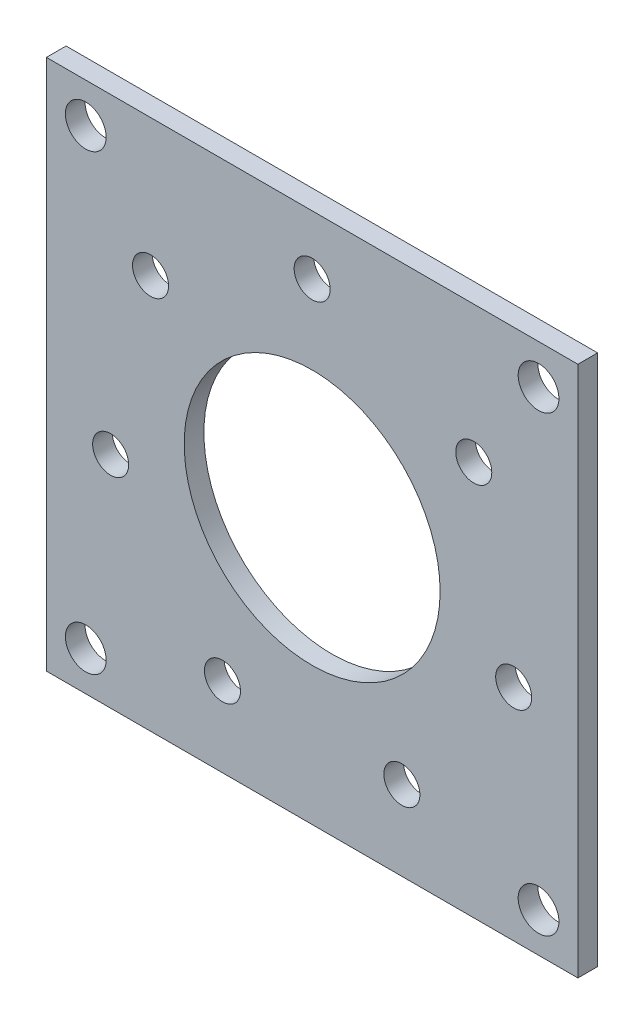
ISO-10303-21;
HEADER;
FILE_DESCRIPTION(('STEP AP214'),'2;1');
FILE_NAME('part.step','',(''),(''),'','','');
FILE_SCHEMA(('AUTOMOTIVE_DESIGN { 1 0 10303 214 1 1 1 1 }'));
ENDSEC;
DATA;
#1=APPLICATION_CONTEXT('core data for automotive mechanical design processes');
#2=APPLICATION_PROTOCOL_DEFINITION('international standard','automotive_design',2000,#1);
#3=PRODUCT_CONTEXT('',#1,'mechanical');
#4=PRODUCT('Part','Part','',(#3));
#5=PRODUCT_RELATED_PRODUCT_CATEGORY('part','',(#4));
#6=PRODUCT_DEFINITION_FORMATION('','',#4);
#7=PRODUCT_DEFINITION_CONTEXT('part definition',#1,'design');
#8=PRODUCT_DEFINITION('design','',#6,#7);
#9=PRODUCT_DEFINITION_SHAPE('','',#8);
#10=(LENGTH_UNIT() NAMED_UNIT(*) SI_UNIT(.MILLI.,.METRE.));
#11=(NAMED_UNIT(*) PLANE_ANGLE_UNIT() SI_UNIT($,.RADIAN.));
#12=(NAMED_UNIT(*) SI_UNIT($,.STERADIAN.) SOLID_ANGLE_UNIT());
#13=UNCERTAINTY_MEASURE_WITH_UNIT(LENGTH_MEASURE(1.E-05),#10,'distance_accuracy_value','');
#14=(GEOMETRIC_REPRESENTATION_CONTEXT(3) GLOBAL_UNCERTAINTY_ASSIGNED_CONTEXT((#13)) GLOBAL_UNIT_ASSIGNED_CONTEXT((#10,
#11,#12)) REPRESENTATION_CONTEXT('',''));
#15=CARTESIAN_POINT('',(0.,0.,0.));
#16=DIRECTION('',(0.,0.,1.));
#17=DIRECTION('',(1.,0.,0.));
#18=AXIS2_PLACEMENT_3D('',#15,#16,#17);
#19=CARTESIAN_POINT('',(0.,0.,5.));
#20=DIRECTION('',(0.,0.,-1.));
#21=DIRECTION('',(-1.,0.,0.));
#22=AXIS2_PLACEMENT_3D('',#19,#20,#21);
#23=PLANE('',#22);
#24=CARTESIAN_POINT('',(-51.183715389543,-11.6823490327087,5.));
#25=DIRECTION('',(0.,0.,1.));
#26=DIRECTION('',(1.,0.,0.));
#27=AXIS2_PLACEMENT_3D('',#24,#25,#26);
#28=CIRCLE('',#27,4.57699286697518);
#29=CARTESIAN_POINT('',(-46.6067225225678,-11.6823490327087,5.));
#30=VERTEX_POINT('',#29);
#31=EDGE_CURVE('E169',#30,#30,#28,.T.);
#32=ORIENTED_EDGE('',*,*,#31,.F.);
#33=EDGE_LOOP('',(#32));
#34=FACE_BOUND('',#33,.T.);
#35=CARTESIAN_POINT('',(22.7788963036761,-47.300865564876,5.));
#36=DIRECTION('',(0.,0.,1.));
#37=DIRECTION('',(1.,0.,0.));
#38=AXIS2_PLACEMENT_3D('',#35,#36,#37);
#39=CIRCLE('',#38,4.57699286697552);
#40=CARTESIAN_POINT('',(27.3558891706516,-47.300865564876,5.));
#41=VERTEX_POINT('',#40);
#42=EDGE_CURVE('E157',#41,#41,#39,.T.);
#43=ORIENTED_EDGE('',*,*,#42,.F.);
#44=EDGE_LOOP('',(#43));
#45=FACE_BOUND('',#44,.T.);
#46=CARTESIAN_POINT('',(41.0461528295716,32.7332145975834,5.));
#47=DIRECTION('',(0.,0.,1.));
#48=DIRECTION('',(1.,0.,0.));
#49=AXIS2_PLACEMENT_3D('',#46,#47,#48);
#50=CIRCLE('',#49,4.57699286697144);
#51=CARTESIAN_POINT('',(45.6231456965431,32.7332145975834,5.));
#52=VERTEX_POINT('',#51);
#53=EDGE_CURVE('E145',#52,#52,#50,.T.);
#54=ORIENTED_EDGE('',*,*,#53,.F.);
#55=EDGE_LOOP('',(#54));
#56=FACE_BOUND('',#55,.T.);
#57=CARTESIAN_POINT('',(0.,0.,5.));
#58=DIRECTION('',(0.,0.,1.));
#59=DIRECTION('',(1.,0.,0.));
#60=AXIS2_PLACEMENT_3D('',#57,#58,#59);
#61=CIRCLE('',#60,32.5);
#62=CARTESIAN_POINT('',(32.5,0.,5.));
#63=VERTEX_POINT('',#62);
#64=EDGE_CURVE('E133',#63,#63,#61,.T.);
#65=ORIENTED_EDGE('',*,*,#64,.F.);
#66=EDGE_LOOP('',(#65));
#67=FACE_BOUND('',#66,.T.);
#68=CARTESIAN_POINT('',(57.5,-57.5,5.));
#69=DIRECTION('',(0.,0.,1.));
#70=DIRECTION('',(1.,0.,0.));
#71=AXIS2_PLACEMENT_3D('',#68,#69,#70);
#72=CIRCLE('',#71,5.17833459756658);
#73=CARTESIAN_POINT('',(62.6783345975666,-57.5,5.));
#74=VERTEX_POINT('',#73);
#75=EDGE_CURVE('E121',#74,#74,#72,.T.);
#76=ORIENTED_EDGE('',*,*,#75,.F.);
#77=EDGE_LOOP('',(#76));
#78=FACE_BOUND('',#77,.T.);
#79=CARTESIAN_POINT('',(-57.5,57.5,5.));
#80=DIRECTION('',(0.,0.,1.));
#81=DIRECTION('',(1.,0.,0.));
#82=AXIS2_PLACEMENT_3D('',#79,#80,#81);
#83=CIRCLE('',#82,5.17833459756658);
#84=CARTESIAN_POINT('',(-52.3216654024334,57.5,5.));
#85=VERTEX_POINT('',#84);
#86=EDGE_CURVE('E100',#85,#85,#83,.T.);
#87=ORIENTED_EDGE('',*,*,#86,.F.);
#88=EDGE_LOOP('',(#87));
#89=FACE_BOUND('',#88,.T.);
#90=DIRECTION('',(0.,1.,0.));
#91=VECTOR('',#90,1.);
#92=CARTESIAN_POINT('',(67.5,-67.5,5.));
#93=LINE('',#92,#91);
#94=CARTESIAN_POINT('',(67.5,-67.5,5.));
#95=VERTEX_POINT('',#94);
#96=CARTESIAN_POINT('',(67.5,67.5,5.));
#97=VERTEX_POINT('',#96);
#98=EDGE_CURVE('E85',#95,#97,#93,.T.);
#99=ORIENTED_EDGE('',*,*,#98,.T.);
#100=DIRECTION('',(-1.,0.,0.));
#101=VECTOR('',#100,1.);
#102=CARTESIAN_POINT('',(-67.5,67.5,5.));
#103=LINE('',#102,#101);
#104=CARTESIAN_POINT('',(-67.5,67.5,5.));
#105=VERTEX_POINT('',#104);
#106=EDGE_CURVE('E80',#97,#105,#103,.T.);
#107=ORIENTED_EDGE('',*,*,#106,.T.);
#108=DIRECTION('',(0.,-1.,0.));
#109=VECTOR('',#108,1.);
#110=CARTESIAN_POINT('',(-67.5,-67.5,5.));
#111=LINE('',#110,#109);
#112=CARTESIAN_POINT('',(-67.5,-67.5,5.));
#113=VERTEX_POINT('',#112);
#114=EDGE_CURVE('E83',#105,#113,#111,.T.);
#115=ORIENTED_EDGE('',*,*,#114,.T.);
#116=DIRECTION('',(1.,0.,0.));
#117=VECTOR('',#116,1.);
#118=CARTESIAN_POINT('',(-67.5,-67.5,5.));
#119=LINE('',#118,#117);
#120=EDGE_CURVE('E50',#113,#95,#119,.T.);
#121=ORIENTED_EDGE('',*,*,#120,.T.);
#122=EDGE_LOOP('',(#99,#107,#115,#121));
#123=FACE_BOUND('',#122,.T.);
#124=CARTESIAN_POINT('',(-57.5,-57.5,5.));
#125=DIRECTION('',(0.,0.,1.));
#126=DIRECTION('',(-1.,0.,0.));
#127=AXIS2_PLACEMENT_3D('',#124,#125,#126);
#128=CIRCLE('',#127,5.17833459756658);
#129=CARTESIAN_POINT('',(-62.6783345975666,-57.5,5.));
#130=VERTEX_POINT('',#129);
#131=EDGE_CURVE('E115',#130,#130,#128,.T.);
#132=ORIENTED_EDGE('',*,*,#131,.F.);
#133=EDGE_LOOP('',(#132));
#134=FACE_BOUND('',#133,.T.);
#135=CARTESIAN_POINT('',(57.5,57.5,5.));
#136=DIRECTION('',(0.,0.,1.));
#137=DIRECTION('',(-1.,0.,0.));
#138=AXIS2_PLACEMENT_3D('',#135,#136,#137);
#139=CIRCLE('',#138,5.17833459756658);
#140=CARTESIAN_POINT('',(52.3216654024334,57.5,5.));
#141=VERTEX_POINT('',#140);
#142=EDGE_CURVE('E127',#141,#141,#139,.T.);
#143=ORIENTED_EDGE('',*,*,#142,.F.);
#144=EDGE_LOOP('',(#143));
#145=FACE_BOUND('',#144,.T.);
#146=CARTESIAN_POINT('',(0.,52.5,5.));
#147=DIRECTION('',(0.,0.,1.));
#148=DIRECTION('',(1.,0.,0.));
#149=AXIS2_PLACEMENT_3D('',#146,#147,#148);
#150=CIRCLE('',#149,4.57699286697144);
#151=CARTESIAN_POINT('',(4.57699286697144,52.5,5.));
#152=VERTEX_POINT('',#151);
#153=EDGE_CURVE('E139',#152,#152,#150,.T.);
#154=ORIENTED_EDGE('',*,*,#153,.F.);
#155=EDGE_LOOP('',(#154));
#156=FACE_BOUND('',#155,.T.);
#157=CARTESIAN_POINT('',(51.1837153895485,-11.6823490327043,5.));
#158=DIRECTION('',(0.,0.,1.));
#159=DIRECTION('',(1.,0.,0.));
#160=AXIS2_PLACEMENT_3D('',#157,#158,#159);
#161=CIRCLE('',#160,4.57699286697361);
#162=CARTESIAN_POINT('',(55.7607082565221,-11.6823490327043,5.));
#163=VERTEX_POINT('',#162);
#164=EDGE_CURVE('E151',#163,#163,#161,.T.);
#165=ORIENTED_EDGE('',*,*,#164,.F.);
#166=EDGE_LOOP('',(#165));
#167=FACE_BOUND('',#166,.T.);
#168=CARTESIAN_POINT('',(-22.7788963036676,-47.300865564878,5.));
#169=DIRECTION('',(0.,0.,1.));
#170=DIRECTION('',(1.,0.,0.));
#171=AXIS2_PLACEMENT_3D('',#168,#169,#170);
#172=CIRCLE('',#171,4.57699286697618);
#173=CARTESIAN_POINT('',(-18.2019034366914,-47.300865564878,5.));
#174=VERTEX_POINT('',#173);
#175=EDGE_CURVE('E163',#174,#174,#172,.T.);
#176=ORIENTED_EDGE('',*,*,#175,.F.);
#177=EDGE_LOOP('',(#176));
#178=FACE_BOUND('',#177,.T.);
#179=CARTESIAN_POINT('',(-41.0461528295707,32.7332145975818,5.));
#180=DIRECTION('',(0.,0.,1.));
#181=DIRECTION('',(1.,0.,0.));
#182=AXIS2_PLACEMENT_3D('',#179,#180,#181);
#183=CIRCLE('',#182,4.57699286697339);
#184=CARTESIAN_POINT('',(-36.4691599625974,32.7332145975818,5.));
#185=VERTEX_POINT('',#184);
#186=EDGE_CURVE('E175',#185,#185,#183,.T.);
#187=ORIENTED_EDGE('',*,*,#186,.F.);
#188=EDGE_LOOP('',(#187));
#189=FACE_BOUND('',#188,.T.);
#190=ADVANCED_FACE('F33',(#34,#45,#56,#67,#78,#89,#123,#134,#145,#156,#167,#178,#189),#23,.F.);
#191=CARTESIAN_POINT('',(0.,0.,0.));
#192=DIRECTION('',(0.,0.,-1.));
#193=DIRECTION('',(-1.,0.,0.));
#194=AXIS2_PLACEMENT_3D('',#191,#192,#193);
#195=PLANE('',#194);
#196=CARTESIAN_POINT('',(-51.183715389543,-11.6823490327087,0.));
#197=DIRECTION('',(0.,0.,1.));
#198=DIRECTION('',(1.,0.,0.));
#199=AXIS2_PLACEMENT_3D('',#196,#197,#198);
#200=CIRCLE('',#199,4.57699286697518);
#201=CARTESIAN_POINT('',(-46.6067225225678,-11.6823490327087,0.));
#202=VERTEX_POINT('',#201);
#203=EDGE_CURVE('E172',#202,#202,#200,.T.);
#204=ORIENTED_EDGE('',*,*,#203,.T.);
#205=EDGE_LOOP('',(#204));
#206=FACE_BOUND('',#205,.T.);
#207=CARTESIAN_POINT('',(22.7788963036761,-47.300865564876,0.));
#208=DIRECTION('',(0.,0.,1.));
#209=DIRECTION('',(1.,0.,0.));
#210=AXIS2_PLACEMENT_3D('',#207,#208,#209);
#211=CIRCLE('',#210,4.57699286697552);
#212=CARTESIAN_POINT('',(27.3558891706516,-47.300865564876,0.));
#213=VERTEX_POINT('',#212);
#214=EDGE_CURVE('E160',#213,#213,#211,.T.);
#215=ORIENTED_EDGE('',*,*,#214,.T.);
#216=EDGE_LOOP('',(#215));
#217=FACE_BOUND('',#216,.T.);
#218=CARTESIAN_POINT('',(41.0461528295716,32.7332145975834,0.));
#219=DIRECTION('',(0.,0.,1.));
#220=DIRECTION('',(1.,0.,0.));
#221=AXIS2_PLACEMENT_3D('',#218,#219,#220);
#222=CIRCLE('',#221,4.57699286697144);
#223=CARTESIAN_POINT('',(45.6231456965431,32.7332145975834,0.));
#224=VERTEX_POINT('',#223);
#225=EDGE_CURVE('E148',#224,#224,#222,.T.);
#226=ORIENTED_EDGE('',*,*,#225,.T.);
#227=EDGE_LOOP('',(#226));
#228=FACE_BOUND('',#227,.T.);
#229=CARTESIAN_POINT('',(0.,0.,0.));
#230=DIRECTION('',(0.,0.,1.));
#231=DIRECTION('',(1.,0.,0.));
#232=AXIS2_PLACEMENT_3D('',#229,#230,#231);
#233=CIRCLE('',#232,32.5);
#234=CARTESIAN_POINT('',(32.5,0.,0.));
#235=VERTEX_POINT('',#234);
#236=EDGE_CURVE('E136',#235,#235,#233,.T.);
#237=ORIENTED_EDGE('',*,*,#236,.T.);
#238=EDGE_LOOP('',(#237));
#239=FACE_BOUND('',#238,.T.);
#240=CARTESIAN_POINT('',(57.5,-57.5,0.));
#241=DIRECTION('',(0.,0.,1.));
#242=DIRECTION('',(1.,0.,0.));
#243=AXIS2_PLACEMENT_3D('',#240,#241,#242);
#244=CIRCLE('',#243,5.17833459756658);
#245=CARTESIAN_POINT('',(62.6783345975666,-57.5,0.));
#246=VERTEX_POINT('',#245);
#247=EDGE_CURVE('E124',#246,#246,#244,.T.);
#248=ORIENTED_EDGE('',*,*,#247,.T.);
#249=EDGE_LOOP('',(#248));
#250=FACE_BOUND('',#249,.T.);
#251=CARTESIAN_POINT('',(-57.5,57.5,0.));
#252=DIRECTION('',(0.,0.,1.));
#253=DIRECTION('',(1.,0.,0.));
#254=AXIS2_PLACEMENT_3D('',#251,#252,#253);
#255=CIRCLE('',#254,5.17833459756658);
#256=CARTESIAN_POINT('',(-52.3216654024334,57.5,0.));
#257=VERTEX_POINT('',#256);
#258=EDGE_CURVE('E112',#257,#257,#255,.T.);
#259=ORIENTED_EDGE('',*,*,#258,.T.);
#260=EDGE_LOOP('',(#259));
#261=FACE_BOUND('',#260,.T.);
#262=DIRECTION('',(0.,1.,0.));
#263=VECTOR('',#262,1.);
#264=CARTESIAN_POINT('',(67.5,-67.5,0.));
#265=LINE('',#264,#263);
#266=CARTESIAN_POINT('',(67.5,-67.5,0.));
#267=VERTEX_POINT('',#266);
#268=CARTESIAN_POINT('',(67.5,67.5,0.));
#269=VERTEX_POINT('',#268);
#270=EDGE_CURVE('E97',#267,#269,#265,.T.);
#271=ORIENTED_EDGE('',*,*,#270,.F.);
#272=DIRECTION('',(1.,0.,0.));
#273=VECTOR('',#272,1.);
#274=CARTESIAN_POINT('',(-67.5,-67.5,0.));
#275=LINE('',#274,#273);
#276=CARTESIAN_POINT('',(-67.5,-67.5,0.));
#277=VERTEX_POINT('',#276);
#278=EDGE_CURVE('E73',#277,#267,#275,.T.);
#279=ORIENTED_EDGE('',*,*,#278,.F.);
#280=DIRECTION('',(0.,-1.,0.));
#281=VECTOR('',#280,1.);
#282=CARTESIAN_POINT('',(-67.5,-67.5,0.));
#283=LINE('',#282,#281);
#284=CARTESIAN_POINT('',(-67.5,67.5,0.));
#285=VERTEX_POINT('',#284);
#286=EDGE_CURVE('E67',#285,#277,#283,.T.);
#287=ORIENTED_EDGE('',*,*,#286,.F.);
#288=DIRECTION('',(-1.,0.,0.));
#289=VECTOR('',#288,1.);
#290=CARTESIAN_POINT('',(-67.5,67.5,0.));
#291=LINE('',#290,#289);
#292=EDGE_CURVE('E89',#269,#285,#291,.T.);
#293=ORIENTED_EDGE('',*,*,#292,.F.);
#294=EDGE_LOOP('',(#271,#279,#287,#293));
#295=FACE_BOUND('',#294,.T.);
#296=CARTESIAN_POINT('',(-57.5,-57.5,0.));
#297=DIRECTION('',(0.,0.,1.));
#298=DIRECTION('',(-1.,0.,0.));
#299=AXIS2_PLACEMENT_3D('',#296,#297,#298);
#300=CIRCLE('',#299,5.17833459756658);
#301=CARTESIAN_POINT('',(-62.6783345975666,-57.5,0.));
#302=VERTEX_POINT('',#301);
#303=EDGE_CURVE('E118',#302,#302,#300,.T.);
#304=ORIENTED_EDGE('',*,*,#303,.T.);
#305=EDGE_LOOP('',(#304));
#306=FACE_BOUND('',#305,.T.);
#307=CARTESIAN_POINT('',(57.5,57.5,0.));
#308=DIRECTION('',(0.,0.,1.));
#309=DIRECTION('',(-1.,0.,0.));
#310=AXIS2_PLACEMENT_3D('',#307,#308,#309);
#311=CIRCLE('',#310,5.17833459756658);
#312=CARTESIAN_POINT('',(52.3216654024334,57.5,0.));
#313=VERTEX_POINT('',#312);
#314=EDGE_CURVE('E130',#313,#313,#311,.T.);
#315=ORIENTED_EDGE('',*,*,#314,.T.);
#316=EDGE_LOOP('',(#315));
#317=FACE_BOUND('',#316,.T.);
#318=CARTESIAN_POINT('',(0.,52.5,0.));
#319=DIRECTION('',(0.,0.,1.));
#320=DIRECTION('',(1.,0.,0.));
#321=AXIS2_PLACEMENT_3D('',#318,#319,#320);
#322=CIRCLE('',#321,4.57699286697144);
#323=CARTESIAN_POINT('',(4.57699286697144,52.5,0.));
#324=VERTEX_POINT('',#323);
#325=EDGE_CURVE('E142',#324,#324,#322,.T.);
#326=ORIENTED_EDGE('',*,*,#325,.T.);
#327=EDGE_LOOP('',(#326));
#328=FACE_BOUND('',#327,.T.);
#329=CARTESIAN_POINT('',(51.1837153895485,-11.6823490327043,0.));
#330=DIRECTION('',(0.,0.,1.));
#331=DIRECTION('',(1.,0.,0.));
#332=AXIS2_PLACEMENT_3D('',#329,#330,#331);
#333=CIRCLE('',#332,4.57699286697361);
#334=CARTESIAN_POINT('',(55.7607082565221,-11.6823490327043,0.));
#335=VERTEX_POINT('',#334);
#336=EDGE_CURVE('E154',#335,#335,#333,.T.);
#337=ORIENTED_EDGE('',*,*,#336,.T.);
#338=EDGE_LOOP('',(#337));
#339=FACE_BOUND('',#338,.T.);
#340=CARTESIAN_POINT('',(-22.7788963036676,-47.300865564878,0.));
#341=DIRECTION('',(0.,0.,1.));
#342=DIRECTION('',(1.,0.,0.));
#343=AXIS2_PLACEMENT_3D('',#340,#341,#342);
#344=CIRCLE('',#343,4.57699286697618);
#345=CARTESIAN_POINT('',(-18.2019034366914,-47.300865564878,0.));
#346=VERTEX_POINT('',#345);
#347=EDGE_CURVE('E166',#346,#346,#344,.T.);
#348=ORIENTED_EDGE('',*,*,#347,.T.);
#349=EDGE_LOOP('',(#348));
#350=FACE_BOUND('',#349,.T.);
#351=CARTESIAN_POINT('',(-41.0461528295707,32.7332145975818,0.));
#352=DIRECTION('',(0.,0.,1.));
#353=DIRECTION('',(1.,0.,0.));
#354=AXIS2_PLACEMENT_3D('',#351,#352,#353);
#355=CIRCLE('',#354,4.57699286697339);
#356=CARTESIAN_POINT('',(-36.4691599625974,32.7332145975818,0.));
#357=VERTEX_POINT('',#356);
#358=EDGE_CURVE('E178',#357,#357,#355,.T.);
#359=ORIENTED_EDGE('',*,*,#358,.T.);
#360=EDGE_LOOP('',(#359));
#361=FACE_BOUND('',#360,.T.);
#362=ADVANCED_FACE('F108',(#206,#217,#228,#239,#250,#261,#295,#306,#317,#328,#339,#350,#361),
#195,.T.);
#363=CARTESIAN_POINT('',(67.5,-67.5,5.));
#364=DIRECTION('',(-1.,0.,0.));
#365=DIRECTION('',(0.,0.,1.));
#366=AXIS2_PLACEMENT_3D('',#363,#364,#365);
#367=PLANE('',#366);
#368=ORIENTED_EDGE('',*,*,#270,.T.);
#369=DIRECTION('',(0.,0.,-1.));
#370=VECTOR('',#369,1.);
#371=CARTESIAN_POINT('',(67.5,67.5,5.));
#372=LINE('',#371,#370);
#373=EDGE_CURVE('E11',#97,#269,#372,.T.);
#374=ORIENTED_EDGE('',*,*,#373,.F.);
#375=ORIENTED_EDGE('',*,*,#98,.F.);
#376=DIRECTION('',(0.,0.,-1.));
#377=VECTOR('',#376,1.);
#378=CARTESIAN_POINT('',(67.5,-67.5,5.));
#379=LINE('',#378,#377);
#380=EDGE_CURVE('E93',#95,#267,#379,.T.);
#381=ORIENTED_EDGE('',*,*,#380,.T.);
#382=EDGE_LOOP('',(#368,#374,#375,#381));
#383=FACE_BOUND('',#382,.T.);
#384=ADVANCED_FACE('F35',(#383),#367,.F.);
#385=CARTESIAN_POINT('',(-67.5,67.5,5.));
#386=DIRECTION('',(0.,-1.,0.));
#387=DIRECTION('',(0.,0.,-1.));
#388=AXIS2_PLACEMENT_3D('',#385,#386,#387);
#389=PLANE('',#388);
#390=ORIENTED_EDGE('',*,*,#292,.T.);
#391=DIRECTION('',(0.,0.,-1.));
#392=VECTOR('',#391,1.);
#393=CARTESIAN_POINT('',(-67.5,67.5,5.));
#394=LINE('',#393,#392);
#395=EDGE_CURVE('E42',#105,#285,#394,.T.);
#396=ORIENTED_EDGE('',*,*,#395,.F.);
#397=ORIENTED_EDGE('',*,*,#106,.F.);
#398=ORIENTED_EDGE('',*,*,#373,.T.);
#399=EDGE_LOOP('',(#390,#396,#397,#398));
#400=FACE_BOUND('',#399,.T.);
#401=ADVANCED_FACE('F88',(#400),#389,.F.);
#402=CARTESIAN_POINT('',(-67.5,-67.5,5.));
#403=DIRECTION('',(1.,0.,0.));
#404=DIRECTION('',(0.,0.,-1.));
#405=AXIS2_PLACEMENT_3D('',#402,#403,#404);
#406=PLANE('',#405);
#407=ORIENTED_EDGE('',*,*,#286,.T.);
#408=DIRECTION('',(0.,0.,-1.));
#409=VECTOR('',#408,1.);
#410=CARTESIAN_POINT('',(-67.5,-67.5,5.));
#411=LINE('',#410,#409);
#412=EDGE_CURVE('E90',#113,#277,#411,.T.);
#413=ORIENTED_EDGE('',*,*,#412,.F.);
#414=ORIENTED_EDGE('',*,*,#114,.F.);
#415=ORIENTED_EDGE('',*,*,#395,.T.);
#416=EDGE_LOOP('',(#407,#413,#414,#415));
#417=FACE_BOUND('',#416,.T.);
#418=ADVANCED_FACE('F91',(#417),#406,.F.);
#419=CARTESIAN_POINT('',(-67.5,-67.5,5.));
#420=DIRECTION('',(0.,1.,0.));
#421=DIRECTION('',(0.,0.,1.));
#422=AXIS2_PLACEMENT_3D('',#419,#420,#421);
#423=PLANE('',#422);
#424=ORIENTED_EDGE('',*,*,#278,.T.);
#425=ORIENTED_EDGE('',*,*,#380,.F.);
#426=ORIENTED_EDGE('',*,*,#120,.F.);
#427=ORIENTED_EDGE('',*,*,#412,.T.);
#428=EDGE_LOOP('',(#424,#425,#426,#427));
#429=FACE_BOUND('',#428,.T.);
#430=ADVANCED_FACE('F105',(#429),#423,.F.);
#431=CARTESIAN_POINT('',(-57.5,57.5,5.));
#432=DIRECTION('',(0.,0.,-1.));
#433=DIRECTION('',(-1.,0.,0.));
#434=AXIS2_PLACEMENT_3D('',#431,#432,#433);
#435=CYLINDRICAL_SURFACE('',#434,5.17833459756658);
#436=ORIENTED_EDGE('',*,*,#86,.T.);
#437=EDGE_LOOP('',(#436));
#438=FACE_BOUND('',#437,.T.);
#439=ORIENTED_EDGE('',*,*,#258,.F.);
#440=EDGE_LOOP('',(#439));
#441=FACE_BOUND('',#440,.T.);
#442=ADVANCED_FACE('F198',(#438,#441),#435,.F.);
#443=CARTESIAN_POINT('',(-57.5,-57.5,5.));
#444=DIRECTION('',(0.,0.,-1.));
#445=DIRECTION('',(-1.,0.,0.));
#446=AXIS2_PLACEMENT_3D('',#443,#444,#445);
#447=CYLINDRICAL_SURFACE('',#446,5.17833459756658);
#448=ORIENTED_EDGE('',*,*,#131,.T.);
#449=EDGE_LOOP('',(#448));
#450=FACE_BOUND('',#449,.T.);
#451=ORIENTED_EDGE('',*,*,#303,.F.);
#452=EDGE_LOOP('',(#451));
#453=FACE_BOUND('',#452,.T.);
#454=ADVANCED_FACE('F244',(#450,#453),#447,.F.);
#455=CARTESIAN_POINT('',(57.5,-57.5,5.));
#456=DIRECTION('',(0.,0.,-1.));
#457=DIRECTION('',(-1.,0.,0.));
#458=AXIS2_PLACEMENT_3D('',#455,#456,#457);
#459=CYLINDRICAL_SURFACE('',#458,5.17833459756658);
#460=ORIENTED_EDGE('',*,*,#75,.T.);
#461=EDGE_LOOP('',(#460));
#462=FACE_BOUND('',#461,.T.);
#463=ORIENTED_EDGE('',*,*,#247,.F.);
#464=EDGE_LOOP('',(#463));
#465=FACE_BOUND('',#464,.T.);
#466=ADVANCED_FACE('F252',(#462,#465),#459,.F.);
#467=CARTESIAN_POINT('',(57.5,57.5,5.));
#468=DIRECTION('',(0.,0.,-1.));
#469=DIRECTION('',(-1.,0.,0.));
#470=AXIS2_PLACEMENT_3D('',#467,#468,#469);
#471=CYLINDRICAL_SURFACE('',#470,5.17833459756658);
#472=ORIENTED_EDGE('',*,*,#142,.T.);
#473=EDGE_LOOP('',(#472));
#474=FACE_BOUND('',#473,.T.);
#475=ORIENTED_EDGE('',*,*,#314,.F.);
#476=EDGE_LOOP('',(#475));
#477=FACE_BOUND('',#476,.T.);
#478=ADVANCED_FACE('F260',(#474,#477),#471,.F.);
#479=CARTESIAN_POINT('',(0.,0.,5.));
#480=DIRECTION('',(0.,0.,-1.));
#481=DIRECTION('',(-1.,0.,0.));
#482=AXIS2_PLACEMENT_3D('',#479,#480,#481);
#483=CYLINDRICAL_SURFACE('',#482,32.5);
#484=ORIENTED_EDGE('',*,*,#64,.T.);
#485=EDGE_LOOP('',(#484));
#486=FACE_BOUND('',#485,.T.);
#487=ORIENTED_EDGE('',*,*,#236,.F.);
#488=EDGE_LOOP('',(#487));
#489=FACE_BOUND('',#488,.T.);
#490=ADVANCED_FACE('F269',(#486,#489),#483,.F.);
#491=CARTESIAN_POINT('',(0.,52.5,5.));
#492=DIRECTION('',(0.,0.,-1.));
#493=DIRECTION('',(-1.,0.,0.));
#494=AXIS2_PLACEMENT_3D('',#491,#492,#493);
#495=CYLINDRICAL_SURFACE('',#494,4.57699286697144);
#496=ORIENTED_EDGE('',*,*,#153,.T.);
#497=EDGE_LOOP('',(#496));
#498=FACE_BOUND('',#497,.T.);
#499=ORIENTED_EDGE('',*,*,#325,.F.);
#500=EDGE_LOOP('',(#499));
#501=FACE_BOUND('',#500,.T.);
#502=ADVANCED_FACE('F278',(#498,#501),#495,.F.);
#503=CARTESIAN_POINT('',(41.0461528295716,32.7332145975834,5.));
#504=DIRECTION('',(0.,0.,-1.));
#505=DIRECTION('',(-1.,0.,0.));
#506=AXIS2_PLACEMENT_3D('',#503,#504,#505);
#507=CYLINDRICAL_SURFACE('',#506,4.57699286697144);
#508=ORIENTED_EDGE('',*,*,#53,.T.);
#509=EDGE_LOOP('',(#508));
#510=FACE_BOUND('',#509,.T.);
#511=ORIENTED_EDGE('',*,*,#225,.F.);
#512=EDGE_LOOP('',(#511));
#513=FACE_BOUND('',#512,.T.);
#514=ADVANCED_FACE('F287',(#510,#513),#507,.F.);
#515=CARTESIAN_POINT('',(51.1837153895485,-11.6823490327043,5.));
#516=DIRECTION('',(0.,0.,-1.));
#517=DIRECTION('',(-1.,0.,0.));
#518=AXIS2_PLACEMENT_3D('',#515,#516,#517);
#519=CYLINDRICAL_SURFACE('',#518,4.57699286697361);
#520=ORIENTED_EDGE('',*,*,#164,.T.);
#521=EDGE_LOOP('',(#520));
#522=FACE_BOUND('',#521,.T.);
#523=ORIENTED_EDGE('',*,*,#336,.F.);
#524=EDGE_LOOP('',(#523));
#525=FACE_BOUND('',#524,.T.);
#526=ADVANCED_FACE('F296',(#522,#525),#519,.F.);
#527=CARTESIAN_POINT('',(22.7788963036761,-47.300865564876,5.));
#528=DIRECTION('',(0.,0.,-1.));
#529=DIRECTION('',(-1.,0.,0.));
#530=AXIS2_PLACEMENT_3D('',#527,#528,#529);
#531=CYLINDRICAL_SURFACE('',#530,4.57699286697552);
#532=ORIENTED_EDGE('',*,*,#42,.T.);
#533=EDGE_LOOP('',(#532));
#534=FACE_BOUND('',#533,.T.);
#535=ORIENTED_EDGE('',*,*,#214,.F.);
#536=EDGE_LOOP('',(#535));
#537=FACE_BOUND('',#536,.T.);
#538=ADVANCED_FACE('F305',(#534,#537),#531,.F.);
#539=CARTESIAN_POINT('',(-22.7788963036676,-47.300865564878,5.));
#540=DIRECTION('',(0.,0.,-1.));
#541=DIRECTION('',(-1.,0.,0.));
#542=AXIS2_PLACEMENT_3D('',#539,#540,#541);
#543=CYLINDRICAL_SURFACE('',#542,4.57699286697618);
#544=ORIENTED_EDGE('',*,*,#175,.T.);
#545=EDGE_LOOP('',(#544));
#546=FACE_BOUND('',#545,.T.);
#547=ORIENTED_EDGE('',*,*,#347,.F.);
#548=EDGE_LOOP('',(#547));
#549=FACE_BOUND('',#548,.T.);
#550=ADVANCED_FACE('F314',(#546,#549),#543,.F.);
#551=CARTESIAN_POINT('',(-51.183715389543,-11.6823490327087,5.));
#552=DIRECTION('',(0.,0.,-1.));
#553=DIRECTION('',(-1.,0.,0.));
#554=AXIS2_PLACEMENT_3D('',#551,#552,#553);
#555=CYLINDRICAL_SURFACE('',#554,4.57699286697518);
#556=ORIENTED_EDGE('',*,*,#31,.T.);
#557=EDGE_LOOP('',(#556));
#558=FACE_BOUND('',#557,.T.);
#559=ORIENTED_EDGE('',*,*,#203,.F.);
#560=EDGE_LOOP('',(#559));
#561=FACE_BOUND('',#560,.T.);
#562=ADVANCED_FACE('F323',(#558,#561),#555,.F.);
#563=CARTESIAN_POINT('',(-41.0461528295707,32.7332145975818,5.));
#564=DIRECTION('',(0.,0.,-1.));
#565=DIRECTION('',(-1.,0.,0.));
#566=AXIS2_PLACEMENT_3D('',#563,#564,#565);
#567=CYLINDRICAL_SURFACE('',#566,4.57699286697339);
#568=ORIENTED_EDGE('',*,*,#186,.T.);
#569=EDGE_LOOP('',(#568));
#570=FACE_BOUND('',#569,.T.);
#571=ORIENTED_EDGE('',*,*,#358,.F.);
#572=EDGE_LOOP('',(#571));
#573=FACE_BOUND('',#572,.T.);
#574=ADVANCED_FACE('F184',(#570,#573),#567,.F.);
#575=CLOSED_SHELL('',(#190,#362,#384,#401,#418,#430,#442,#454,#466,#478,#490,#502,#514,#526,
#538,#550,#562,#574));
#576=MANIFOLD_SOLID_BREP('B2',#575);
#577=ADVANCED_BREP_SHAPE_REPRESENTATION('',(#18,#576),#14);
#578=SHAPE_DEFINITION_REPRESENTATION(#9,#577);
ENDSEC;
END-ISO-10303-21;
